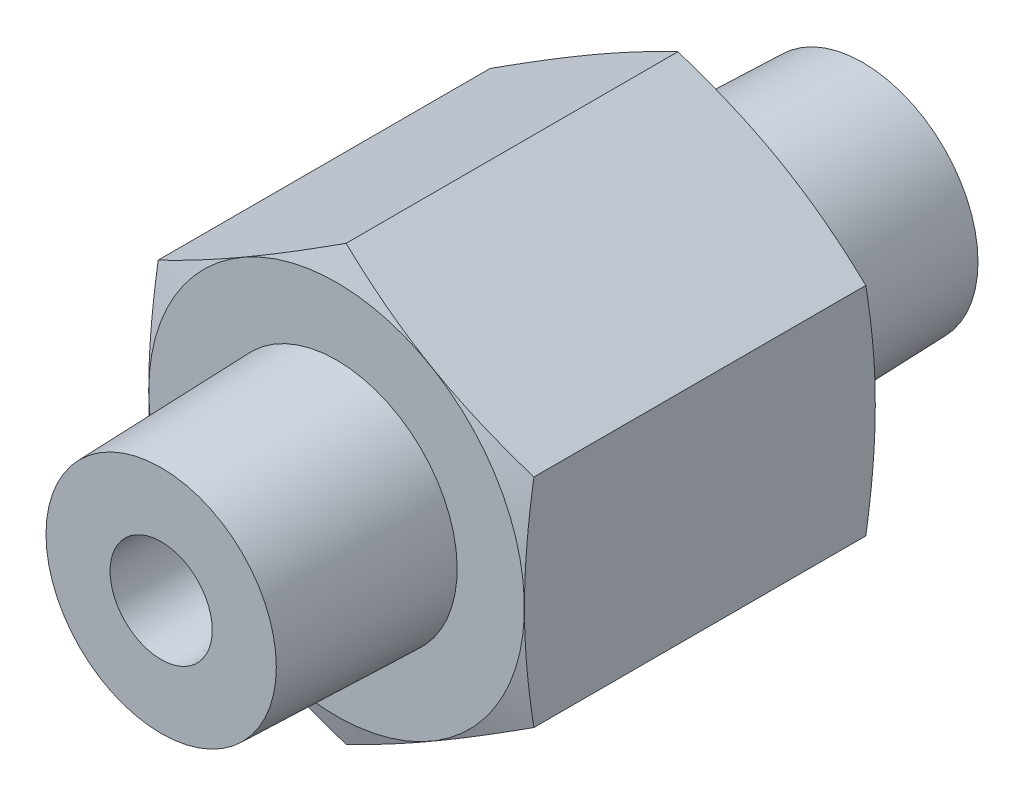
ISO-10303-21;
HEADER;
FILE_DESCRIPTION(('STEP AP214'),'2;1');
FILE_NAME('part.step','',(''),(''),'','','');
FILE_SCHEMA(('AUTOMOTIVE_DESIGN { 1 0 10303 214 1 1 1 1 }'));
ENDSEC;
DATA;
#1=APPLICATION_CONTEXT('core data for automotive mechanical design processes');
#2=APPLICATION_PROTOCOL_DEFINITION('international standard','automotive_design',2000,#1);
#3=PRODUCT_CONTEXT('',#1,'mechanical');
#4=PRODUCT('Part','Part','',(#3));
#5=PRODUCT_RELATED_PRODUCT_CATEGORY('part','',(#4));
#6=PRODUCT_DEFINITION_FORMATION('','',#4);
#7=PRODUCT_DEFINITION_CONTEXT('part definition',#1,'design');
#8=PRODUCT_DEFINITION('design','',#6,#7);
#9=PRODUCT_DEFINITION_SHAPE('','',#8);
#10=(LENGTH_UNIT() NAMED_UNIT(*) SI_UNIT(.MILLI.,.METRE.));
#11=(NAMED_UNIT(*) PLANE_ANGLE_UNIT() SI_UNIT($,.RADIAN.));
#12=(NAMED_UNIT(*) SI_UNIT($,.STERADIAN.) SOLID_ANGLE_UNIT());
#13=UNCERTAINTY_MEASURE_WITH_UNIT(LENGTH_MEASURE(1.E-05),#10,'distance_accuracy_value','');
#14=(GEOMETRIC_REPRESENTATION_CONTEXT(3) GLOBAL_UNCERTAINTY_ASSIGNED_CONTEXT((#13)) GLOBAL_UNIT_ASSIGNED_CONTEXT((#10,
#11,#12)) REPRESENTATION_CONTEXT('',''));
#15=CARTESIAN_POINT('',(0.,0.,0.));
#16=DIRECTION('',(0.,0.,1.));
#17=DIRECTION('',(1.,0.,0.));
#18=AXIS2_PLACEMENT_3D('',#15,#16,#17);
#19=CARTESIAN_POINT('',(-6.03249999999997,-33.4507708327137,0.));
#20=DIRECTION('',(0.5,-0.866025403784439,0.));
#21=DIRECTION('',(0.866025403784439,0.5,0.));
#22=AXIS2_PLACEMENT_3D('',#19,#20,#21);
#23=PLANE('',#22);
#24=CARTESIAN_POINT('',(-12.8328840177273,-37.3769743759413,12.3564425725315));
#25=CARTESIAN_POINT('',(-12.550927742631,-37.2141868446148,12.4095177281131));
#26=CARTESIAN_POINT('',(-12.268221299139,-37.050966203363,12.4577566042993));
#27=CARTESIAN_POINT('',(-11.7013331856382,-36.723673198433,12.5425743691434));
#28=CARTESIAN_POINT('',(-11.4171507160176,-36.5596003730986,12.5791460762072));
#29=CARTESIAN_POINT('',(-10.8498479774758,-36.2320679842894,12.6383459404696));
#30=CARTESIAN_POINT('',(-10.5667360662956,-36.0686132461587,12.6610780223526));
#31=CARTESIAN_POINT('',(-9.99997999919568,-35.7413964782538,12.6915643874731));
#32=CARTESIAN_POINT('',(-9.71633602461469,-35.5776345531754,12.6993230805206));
#33=CARTESIAN_POINT('',(-9.14904807545271,-35.2501107030187,12.6993230805206));
#34=CARTESIAN_POINT('',(-8.86540410087172,-35.0863487779404,12.6915643874731));
#35=CARTESIAN_POINT('',(-8.29864803377181,-34.7591320100354,12.6610780223526));
#36=CARTESIAN_POINT('',(-8.01553612259163,-34.5956772719047,12.6383459404696));
#37=CARTESIAN_POINT('',(-7.44823338404979,-34.2681448830956,12.5791460762072));
#38=CARTESIAN_POINT('',(-7.1640509144292,-34.1040720577611,12.5425743691434));
#39=CARTESIAN_POINT('',(-6.59716280092842,-33.7767790528311,12.4577566042993));
#40=CARTESIAN_POINT('',(-6.31445635743641,-33.6135584115793,12.4095177281131));
#41=CARTESIAN_POINT('',(-6.03250008234015,-33.4507708802528,12.3564425725315));
#42=B_SPLINE_CURVE_WITH_KNOTS('',3,(#24,#25,#26,#27,#28,#29,#30,#31,#32,#33,#34,#35,#36,#37,#38,
#39,#40,#41),.UNSPECIFIED.,.F.,.F.,(4,2,2,2,2,2,2,2,4),(0.,0.989698182463142,1.98000439227697,
2.96277938624906,3.94526489913871,4.92775041202836,5.91052540600045,6.90083161581427,
7.89052979827742),.UNSPECIFIED.);
#43=CARTESIAN_POINT('',(-12.8328840810797,-37.376974434443,12.3564425534643));
#44=VERTEX_POINT('',#43);
#45=CARTESIAN_POINT('',(-6.03250004117006,-33.4507708564832,12.3564425647844));
#46=VERTEX_POINT('',#45);
#47=EDGE_CURVE('E21',#44,#46,#42,.T.);
#48=ORIENTED_EDGE('',*,*,#47,.F.);
#49=DIRECTION('',(0.,0.,1.));
#50=VECTOR('',#49,1.);
#51=CARTESIAN_POINT('',(-12.8328841000674,-37.3769744234805,0.));
#52=LINE('',#51,#50);
#53=CARTESIAN_POINT('',(-12.8328840588973,-37.3769743997109,0.343557435215651));
#54=VERTEX_POINT('',#53);
#55=EDGE_CURVE('E73',#54,#44,#52,.T.);
#56=ORIENTED_EDGE('',*,*,#55,.F.);
#57=CARTESIAN_POINT('',(-6.03250008234016,-33.4507708802528,0.343557427468529));
#58=CARTESIAN_POINT('',(-6.31445635743643,-33.6135584115793,0.290482271886874));
#59=CARTESIAN_POINT('',(-6.59716280092843,-33.7767790528311,0.242243395700738));
#60=CARTESIAN_POINT('',(-7.1640509144292,-34.1040720577611,0.157425630856585));
#61=CARTESIAN_POINT('',(-7.44823338404979,-34.2681448830956,0.120853923792779));
#62=CARTESIAN_POINT('',(-8.01553612259164,-34.5956772719047,0.0616540595304248));
#63=CARTESIAN_POINT('',(-8.29864803377182,-34.7591320100354,0.0389219776474011));
#64=CARTESIAN_POINT('',(-8.86540410087173,-35.0863487779404,0.00843561252692523));
#65=CARTESIAN_POINT('',(-9.14904807545272,-35.2501107030187,0.000676919479423843));
#66=CARTESIAN_POINT('',(-9.7163360246147,-35.5776345531754,0.000676919479426301));
#67=CARTESIAN_POINT('',(-9.99997999919569,-35.7413964782538,0.00843561252693018));
#68=CARTESIAN_POINT('',(-10.5667360662956,-36.0686132461588,0.0389219776474103));
#69=CARTESIAN_POINT('',(-10.8498479774758,-36.2320679842894,0.0616540595304358));
#70=CARTESIAN_POINT('',(-11.4171507160176,-36.5596003730986,0.120853923792794));
#71=CARTESIAN_POINT('',(-11.7013331856382,-36.723673198433,0.157425630856602));
#72=CARTESIAN_POINT('',(-12.268221299139,-37.0509662033631,0.242243395700759));
#73=CARTESIAN_POINT('',(-12.550927742631,-37.2141868446148,0.290482271886897));
#74=CARTESIAN_POINT('',(-12.8328840177273,-37.3769743759413,0.343557427468553));
#75=B_SPLINE_CURVE_WITH_KNOTS('',3,(#57,#58,#59,#60,#61,#62,#63,#64,#65,#66,#67,#68,#69,#70,#71,
#72,#73,#74),.UNSPECIFIED.,.F.,.F.,(4,2,2,2,2,2,2,2,4),(0.,0.989698182463137,1.98000439227696,
2.96277938624906,3.94526489913871,4.92775041202836,5.91052540600045,6.90083161581428,
7.89052979827742),.UNSPECIFIED.);
#76=CARTESIAN_POINT('',(-6.03249999999997,-33.4507708546388,0.343557446535684));
#77=VERTEX_POINT('',#76);
#78=EDGE_CURVE('E90',#77,#54,#75,.T.);
#79=ORIENTED_EDGE('',*,*,#78,.F.);
#80=DIRECTION('',(0.,0.,-1.));
#81=VECTOR('',#80,1.);
#82=CARTESIAN_POINT('',(-6.03249999999997,-33.4507708327137,0.));
#83=LINE('',#82,#81);
#84=EDGE_CURVE('E88',#46,#77,#83,.T.);
#85=ORIENTED_EDGE('',*,*,#84,.F.);
#86=EDGE_LOOP('',(#48,#56,#79,#85));
#87=FACE_BOUND('',#86,.T.);
#88=ADVANCED_FACE('F17',(#87),#23,.T.);
#89=CARTESIAN_POINT('',(-12.8328841000674,-37.3769744234805,0.));
#90=DIRECTION('',(-0.5,-0.866025403784439,0.));
#91=DIRECTION('',(0.866025403784439,-0.5,0.));
#92=AXIS2_PLACEMENT_3D('',#89,#90,#91);
#93=PLANE('',#92);
#94=CARTESIAN_POINT('',(-19.6332682381102,-33.4507708107886,12.3564425498913));
#95=CARTESIAN_POINT('',(-19.3513119530993,-33.6135583478394,12.4095177087426));
#96=CARTESIAN_POINT('',(-19.0686054996384,-33.7767789948467,12.4577565880047));
#97=CARTESIAN_POINT('',(-18.5017173660647,-34.1040720113658,12.5425743583843));
#98=CARTESIAN_POINT('',(-18.2175348863401,-34.2681448425338,12.5791460679065));
#99=CARTESIAN_POINT('',(-17.6502321276936,-34.5956772429504,12.6383459361976));
#100=CARTESIAN_POINT('',(-17.3671202065141,-34.7591319868542,12.661078019664));
#101=CARTESIAN_POINT('',(-16.8003641193643,-35.086348766335,12.69156438692));
#102=CARTESIAN_POINT('',(-16.5167201347327,-35.2501106972161,12.6993230805206));
#103=CARTESIAN_POINT('',(-15.9494321654696,-35.5776345589782,12.6993230805206));
#104=CARTESIAN_POINT('',(-15.665788180838,-35.7413964898592,12.69156438692));
#105=CARTESIAN_POINT('',(-15.0990320936881,-36.06861326934,12.661078019664));
#106=CARTESIAN_POINT('',(-14.8159201725086,-36.2320680132438,12.6383459361976));
#107=CARTESIAN_POINT('',(-14.2486174138621,-36.5596004136604,12.5791460679064));
#108=CARTESIAN_POINT('',(-13.9644349341375,-36.7236732448284,12.5425743583843));
#109=CARTESIAN_POINT('',(-13.3975468005639,-37.0509662613475,12.4577565880046));
#110=CARTESIAN_POINT('',(-13.1148403471029,-37.2141869083548,12.4095177087426));
#111=CARTESIAN_POINT('',(-12.832884062092,-37.3769744454056,12.3564425498913));
#112=B_SPLINE_CURVE_WITH_KNOTS('',3,(#94,#95,#96,#97,#98,#99,#100,#101,#102,#103,#104,#105,#106,
#107,#108,#109,#110,#111),.UNSPECIFIED.,.F.,.F.,(4,2,2,2,2,2,2,2,4),(0.,0.989698217952918,
1.98000446335259,2.96277949217826,3.94526503987528,4.9277505875723,5.91052561639798,
6.90083186179764,7.89053007975056),.UNSPECIFIED.);
#113=CARTESIAN_POINT('',(-19.6332682001348,-33.4507707851745,12.3564425647844));
#114=VERTEX_POINT('',#113);
#115=EDGE_CURVE('E86',#114,#44,#112,.T.);
#116=ORIENTED_EDGE('',*,*,#115,.F.);
#117=DIRECTION('',(0.,0.,1.));
#118=VECTOR('',#117,1.);
#119=CARTESIAN_POINT('',(-19.6332682001348,-33.4507708327137,0.));
#120=LINE('',#119,#118);
#121=CARTESIAN_POINT('',(-19.6332681589647,-33.4507708564833,0.343557435215632));
#122=VERTEX_POINT('',#121);
#123=EDGE_CURVE('E188',#122,#114,#120,.T.);
#124=ORIENTED_EDGE('',*,*,#123,.F.);
#125=CARTESIAN_POINT('',(-12.832884062092,-37.3769744454056,0.343557450108682));
#126=CARTESIAN_POINT('',(-13.1148403420316,-37.2141869112828,0.290482292214261));
#127=CARTESIAN_POINT('',(-13.3975467903913,-37.0509662672206,0.242243413732464));
#128=CARTESIAN_POINT('',(-13.964434913709,-36.7236732566228,0.157425644457741));
#129=CARTESIAN_POINT('',(-14.2486173882789,-36.5596004284309,0.120853935259739));
#130=CARTESIAN_POINT('',(-14.8159201366915,-36.2320680339229,0.0616540670476583));
#131=CARTESIAN_POINT('',(-15.0990320527923,-36.0686132929513,0.038921983343592));
#132=CARTESIAN_POINT('',(-15.6657881297984,-35.7413965193269,0.00843561501878566));
#133=CARTESIAN_POINT('',(-15.9494321093649,-35.5776345913702,0.000676920587548373));
#134=CARTESIAN_POINT('',(-16.5167200685775,-35.2501107354108,0.000676918371346657));
#135=CARTESIAN_POINT('',(-16.8003640482235,-35.0863488074081,0.00843561058818436));
#136=CARTESIAN_POINT('',(-17.3671201254671,-34.7591320336467,0.0389219746398821));
#137=CARTESIAN_POINT('',(-17.650232041726,-34.5956772925838,0.0616540562851944));
#138=CARTESIAN_POINT('',(-18.2175347905018,-34.2681448978661,0.120853920626624));
#139=CARTESIAN_POINT('',(-18.5017172652771,-34.1040720695556,0.157425628014555));
#140=CARTESIAN_POINT('',(-19.0686053890338,-33.7767790587043,0.242243393963656));
#141=CARTESIAN_POINT('',(-19.351311837627,-33.6135584145073,0.290482270930066));
#142=CARTESIAN_POINT('',(-19.6332681177947,-33.4507708802528,0.343557427468551));
#143=B_SPLINE_CURVE_WITH_KNOTS('',3,(#125,#126,#127,#128,#129,#130,#131,#132,#133,#134,#135,
#136,#137,#138,#139,#140,#141,#142),.UNSPECIFIED.,.F.,.F.,(4,2,2,2,2,2,2,2,4),(0.,
0.989698200145738,1.98000442770477,2.96277943904958,3.94526496928586,4.92775049963624,
5.9105255110892,6.90083173874365,7.89052993901396),.UNSPECIFIED.);
#144=EDGE_CURVE('E139',#54,#122,#143,.T.);
#145=ORIENTED_EDGE('',*,*,#144,.F.);
#146=ORIENTED_EDGE('',*,*,#55,.T.);
#147=EDGE_LOOP('',(#116,#124,#145,#146));
#148=FACE_BOUND('',#147,.T.);
#149=ADVANCED_FACE('F161',(#148),#93,.T.);
#150=CARTESIAN_POINT('',(-19.6332682001348,-33.4507708327137,0.));
#151=DIRECTION('',(-1.,0.,0.));
#152=DIRECTION('',(0.,-1.,0.));
#153=AXIS2_PLACEMENT_3D('',#150,#151,#152);
#154=PLANE('',#153);
#155=CARTESIAN_POINT('',(-19.6332682001348,-25.59836360733,12.3564425498914));
#156=CARTESIAN_POINT('',(-19.6332682001348,-25.9239386755756,12.4095177077858));
#157=CARTESIAN_POINT('',(-19.6332682001348,-26.2503799636999,12.4577565862676));
#158=CARTESIAN_POINT('',(-19.6332682001348,-26.9049659848956,12.5425743555423));
#159=CARTESIAN_POINT('',(-19.6332682001348,-27.2331116412794,12.5791460647403));
#160=CARTESIAN_POINT('',(-19.6332682001348,-27.8881764302954,12.6383459329524));
#161=CARTESIAN_POINT('',(-19.6332682001348,-28.2150859122386,12.6610780166565));
#162=CARTESIAN_POINT('',(-19.6332682001348,-28.8695194594873,12.6915643849813));
#163=CARTESIAN_POINT('',(-19.6332682001348,-29.1970433154008,12.6993230794125));
#164=CARTESIAN_POINT('',(-19.6332682001348,-29.8520910273196,12.6993230816287));
#165=CARTESIAN_POINT('',(-19.6332682001348,-30.1796148833249,12.6915643894119));
#166=CARTESIAN_POINT('',(-19.6332682001348,-30.8340484308478,12.6610780253602));
#167=CARTESIAN_POINT('',(-19.6332682001348,-31.1609579129735,12.6383459437148));
#168=CARTESIAN_POINT('',(-19.6332682001348,-31.8160227024089,12.5791460793734));
#169=CARTESIAN_POINT('',(-19.6332682001348,-32.1441683590299,12.5425743719855));
#170=CARTESIAN_POINT('',(-19.6332682001348,-32.7987543807326,12.4577566060364));
#171=CARTESIAN_POINT('',(-19.6332682001348,-33.1251956691265,12.40951772907));
#172=CARTESIAN_POINT('',(-19.6332682001348,-33.4507707376354,12.3564425725315));
#173=B_SPLINE_CURVE_WITH_KNOTS('',3,(#155,#156,#157,#158,#159,#160,#161,#162,#163,#164,#165,
#166,#167,#168,#169,#170,#171,#172),.UNSPECIFIED.,.F.,.F.,(4,2,2,2,2,2,2,2,4),(0.,
0.989698200145731,1.98000442770475,2.96277943904954,3.94526496928581,4.92775049963618,
5.91052551108913,6.90083173874357,7.89052993901387),.UNSPECIFIED.);
#174=CARTESIAN_POINT('',(-19.6332681589647,-25.5983636274107,12.3564425647844));
#175=VERTEX_POINT('',#174);
#176=EDGE_CURVE('E167',#175,#114,#173,.T.);
#177=ORIENTED_EDGE('',*,*,#176,.F.);
#178=DIRECTION('',(0.,0.,1.));
#179=VECTOR('',#178,1.);
#180=CARTESIAN_POINT('',(-19.6332682001348,-25.5983636511802,0.));
#181=LINE('',#180,#179);
#182=CARTESIAN_POINT('',(-19.6332682001348,-25.5983636987193,0.343557435215582));
#183=VERTEX_POINT('',#182);
#184=EDGE_CURVE('E185',#183,#175,#181,.T.);
#185=ORIENTED_EDGE('',*,*,#184,.F.);
#186=CARTESIAN_POINT('',(-19.6332682001348,-33.4507708765639,0.343557450108652));
#187=CARTESIAN_POINT('',(-19.6332682001348,-33.1251958083183,0.29048229221423));
#188=CARTESIAN_POINT('',(-19.6332682001348,-32.798754520194,0.242243413732431));
#189=CARTESIAN_POINT('',(-19.6332682001348,-32.1441684989983,0.157425644457706));
#190=CARTESIAN_POINT('',(-19.6332682001348,-31.8160228426145,0.120853935259704));
#191=CARTESIAN_POINT('',(-19.6332682001348,-31.1609580535985,0.0616540670476204));
#192=CARTESIAN_POINT('',(-19.6332682001348,-30.8340485716553,0.0389219833435524));
#193=CARTESIAN_POINT('',(-19.6332682001348,-30.1796150244066,0.00843561501874323));
#194=CARTESIAN_POINT('',(-19.6332682001348,-29.8520911684931,0.000676920587504881));
#195=CARTESIAN_POINT('',(-19.6332682001348,-29.1970434565743,0.000676918371300269));
#196=CARTESIAN_POINT('',(-19.6332682001348,-28.869519600569,0.00843561058813616));
#197=CARTESIAN_POINT('',(-19.6332682001348,-28.2150860530461,0.0389219746398311));
#198=CARTESIAN_POINT('',(-19.6332682001348,-27.8881765709204,0.0616540562851423));
#199=CARTESIAN_POINT('',(-19.6332682001348,-27.233111781485,0.120853920626569));
#200=CARTESIAN_POINT('',(-19.6332682001348,-26.9049661248639,0.1574256280145));
#201=CARTESIAN_POINT('',(-19.6332682001348,-26.2503801031613,0.242243393963598));
#202=CARTESIAN_POINT('',(-19.6332682001348,-25.9239388147674,0.290482270930008));
#203=CARTESIAN_POINT('',(-19.6332682001348,-25.5983637462584,0.343557427468491));
#204=B_SPLINE_CURVE_WITH_KNOTS('',3,(#186,#187,#188,#189,#190,#191,#192,#193,#194,#195,#196,
#197,#198,#199,#200,#201,#202,#203),.UNSPECIFIED.,.F.,.F.,(4,2,2,2,2,2,2,2,4),(0.,
0.989698200145739,1.98000442770476,2.96277943904955,3.94526496928582,4.9277504996362,
5.91052551108915,6.90083173874359,7.89052993901389),.UNSPECIFIED.);
#205=EDGE_CURVE('E152',#122,#183,#204,.T.);
#206=ORIENTED_EDGE('',*,*,#205,.F.);
#207=ORIENTED_EDGE('',*,*,#123,.T.);
#208=EDGE_LOOP('',(#177,#185,#206,#207));
#209=FACE_BOUND('',#208,.T.);
#210=ADVANCED_FACE('F157',(#209),#154,.T.);
#211=CARTESIAN_POINT('',(-19.6332682001348,-25.5983636511802,0.));
#212=DIRECTION('',(-0.500000000000001,0.866025403784438,0.));
#213=DIRECTION('',(-0.866025403784438,-0.500000000000001,0.));
#214=AXIS2_PLACEMENT_3D('',#211,#212,#213);
#215=PLANE('',#214);
#216=CARTESIAN_POINT('',(-12.832884062092,-21.6721600384883,12.3564425498914));
#217=CARTESIAN_POINT('',(-13.1148403420315,-21.8349475726111,12.4095177077858));
#218=CARTESIAN_POINT('',(-13.3975467903913,-21.9981682166733,12.4577565862676));
#219=CARTESIAN_POINT('',(-13.964434913709,-22.3254612272711,12.5425743555424));
#220=CARTESIAN_POINT('',(-14.2486173882788,-22.489534055463,12.5791460647404));
#221=CARTESIAN_POINT('',(-14.8159201366914,-22.817066449971,12.6383459329524));
#222=CARTESIAN_POINT('',(-15.0990320527922,-22.9805211909426,12.6610780166565));
#223=CARTESIAN_POINT('',(-15.6657881297984,-23.307737964567,12.6915643849813));
#224=CARTESIAN_POINT('',(-15.9494321093649,-23.4714998925237,12.6993230794126));
#225=CARTESIAN_POINT('',(-16.5167200685775,-23.7990237484832,12.6993230816288));
#226=CARTESIAN_POINT('',(-16.8003640482235,-23.9627856764858,12.6915643894119));
#227=CARTESIAN_POINT('',(-17.3671201254671,-24.2900024502473,12.6610780253602));
#228=CARTESIAN_POINT('',(-17.650232041726,-24.4534571913101,12.6383459437149));
#229=CARTESIAN_POINT('',(-18.2175347905017,-24.7809895860278,12.5791460793735));
#230=CARTESIAN_POINT('',(-18.5017172652771,-24.9450624143383,12.5425743719855));
#231=CARTESIAN_POINT('',(-19.0686053890338,-25.2723554251897,12.4577566060364));
#232=CARTESIAN_POINT('',(-19.351311837627,-25.4355760693866,12.40951772907));
#233=CARTESIAN_POINT('',(-19.6332681177946,-25.5983636036411,12.3564425725315));
#234=B_SPLINE_CURVE_WITH_KNOTS('',3,(#216,#217,#218,#219,#220,#221,#222,#223,#224,#225,#226,
#227,#228,#229,#230,#231,#232,#233),.UNSPECIFIED.,.F.,.F.,(4,2,2,2,2,2,2,2,4),(0.,
0.98969820014575,1.98000442770479,2.9627794390496,3.94526496928588,4.92775049963627,
5.91052551108923,6.9008317387437,7.89052993901401),.UNSPECIFIED.);
#235=CARTESIAN_POINT('',(-12.8328840588973,-21.6721600841829,12.3564425647844));
#236=VERTEX_POINT('',#235);
#237=EDGE_CURVE('E97',#236,#175,#234,.T.);
#238=ORIENTED_EDGE('',*,*,#237,.F.);
#239=DIRECTION('',(0.,0.,1.));
#240=VECTOR('',#239,1.);
#241=CARTESIAN_POINT('',(-12.8328841000674,-21.6721600604134,0.));
#242=LINE('',#241,#240);
#243=CARTESIAN_POINT('',(-12.8328841412375,-21.6721600841829,0.343557435215571));
#244=VERTEX_POINT('',#243);
#245=EDGE_CURVE('E190',#244,#236,#242,.T.);
#246=ORIENTED_EDGE('',*,*,#245,.F.);
#247=CARTESIAN_POINT('',(-19.6332682381102,-25.5983636731053,0.343557450108609));
#248=CARTESIAN_POINT('',(-19.3513119581706,-25.4355761389825,0.290482292214186));
#249=CARTESIAN_POINT('',(-19.0686055098109,-25.2723554949204,0.242243413732385));
#250=CARTESIAN_POINT('',(-18.5017173864932,-24.9450624843225,0.157425644457658));
#251=CARTESIAN_POINT('',(-18.2175349119234,-24.7809896561306,0.120853935259654));
#252=CARTESIAN_POINT('',(-17.6502321635107,-24.4534572616226,0.0616540670475697));
#253=CARTESIAN_POINT('',(-17.3671202474099,-24.290002520651,0.0389219833435019));
#254=CARTESIAN_POINT('',(-16.8003641704038,-23.9627857470266,0.00843561501869313));
#255=CARTESIAN_POINT('',(-16.5167201908373,-23.7990238190699,0.000676920587455213));
#256=CARTESIAN_POINT('',(-15.9494322316247,-23.4714999631105,0.0006769183712529));
#257=CARTESIAN_POINT('',(-15.6657882519787,-23.3077380351078,0.00843561058809058));
#258=CARTESIAN_POINT('',(-15.0990321747351,-22.9805212613464,0.0389219746397892));
#259=CARTESIAN_POINT('',(-14.8159202584762,-22.8170665202835,0.0616540562851022));
#260=CARTESIAN_POINT('',(-14.2486175097004,-22.4895341255658,0.120853920626534));
#261=CARTESIAN_POINT('',(-13.9644350349251,-22.3254612972553,0.157425628014467));
#262=CARTESIAN_POINT('',(-13.3975469111684,-21.998168286404,0.242243393963571));
#263=CARTESIAN_POINT('',(-13.1148404625751,-21.834947642207,0.290482270929984));
#264=CARTESIAN_POINT('',(-12.8328841824075,-21.6721601079525,0.34355742746847));
#265=B_SPLINE_CURVE_WITH_KNOTS('',3,(#247,#248,#249,#250,#251,#252,#253,#254,#255,#256,#257,
#258,#259,#260,#261,#262,#263,#264),.UNSPECIFIED.,.F.,.F.,(4,2,2,2,2,2,2,2,4),(0.,
0.989698200145752,1.98000442770478,2.96277943904959,3.94526496928588,4.92775049963627,
5.91052551108924,6.9008317387437,7.89052993901401),.UNSPECIFIED.);
#266=EDGE_CURVE('E148',#183,#244,#265,.T.);
#267=ORIENTED_EDGE('',*,*,#266,.F.);
#268=ORIENTED_EDGE('',*,*,#184,.T.);
#269=EDGE_LOOP('',(#238,#246,#267,#268));
#270=FACE_BOUND('',#269,.T.);
#271=ADVANCED_FACE('F160',(#270),#215,.T.);
#272=CARTESIAN_POINT('',(-12.8328841000674,-21.6721600604134,0.));
#273=DIRECTION('',(0.499999999999999,0.866025403784439,0.));
#274=DIRECTION('',(-0.866025403784439,0.499999999999999,0.));
#275=AXIS2_PLACEMENT_3D('',#272,#273,#274);
#276=PLANE('',#275);
#277=CARTESIAN_POINT('',(-6.03249996202456,-25.5983636731052,12.3564425498914));
#278=CARTESIAN_POINT('',(-6.31445624196411,-25.4355761389824,12.4095177077858));
#279=CARTESIAN_POINT('',(-6.59716269032386,-25.2723554949203,12.4577565862676));
#280=CARTESIAN_POINT('',(-7.16405081364155,-24.9450624843224,12.5425743555423));
#281=CARTESIAN_POINT('',(-7.4482332882114,-24.7809896561306,12.5791460647403));
#282=CARTESIAN_POINT('',(-8.015536036624,-24.4534572616225,12.6383459329524));
#283=CARTESIAN_POINT('',(-8.29864795272482,-24.2900025206509,12.6610780166565));
#284=CARTESIAN_POINT('',(-8.86540402973094,-23.9627857470266,12.6915643849813));
#285=CARTESIAN_POINT('',(-9.14904800929749,-23.7990238190698,12.6993230794125));
#286=CARTESIAN_POINT('',(-9.71633596851005,-23.4714999631104,12.6993230816287));
#287=CARTESIAN_POINT('',(-9.99997994815607,-23.3077380351078,12.6915643894119));
#288=CARTESIAN_POINT('',(-10.5667360253997,-22.9805212613463,12.6610780253602));
#289=CARTESIAN_POINT('',(-10.8498479416586,-22.8170665202835,12.6383459437149));
#290=CARTESIAN_POINT('',(-11.4171506904343,-22.4895341255658,12.5791460793735));
#291=CARTESIAN_POINT('',(-11.7013331652097,-22.3254612972552,12.5425743719855));
#292=CARTESIAN_POINT('',(-12.2682212889664,-21.9981682864039,12.4577566060364));
#293=CARTESIAN_POINT('',(-12.5509277375596,-21.834947642207,12.40951772907));
#294=CARTESIAN_POINT('',(-12.8328840177272,-21.6721601079525,12.3564425725315));
#295=B_SPLINE_CURVE_WITH_KNOTS('',3,(#277,#278,#279,#280,#281,#282,#283,#284,#285,#286,#287,
#288,#289,#290,#291,#292,#293,#294),.UNSPECIFIED.,.F.,.F.,(4,2,2,2,2,2,2,2,4),(0.,
0.98969820014575,1.98000442770479,2.96277943904959,3.94526496928588,4.92775049963627,
5.91052551108923,6.9008317387437,7.89052993901401),.UNSPECIFIED.);
#296=CARTESIAN_POINT('',(-6.03249999999997,-25.5983636987193,12.3564425647844));
#297=VERTEX_POINT('',#296);
#298=EDGE_CURVE('E96',#297,#236,#295,.T.);
#299=ORIENTED_EDGE('',*,*,#298,.F.);
#300=DIRECTION('',(0.,0.,-1.));
#301=VECTOR('',#300,1.);
#302=CARTESIAN_POINT('',(-6.03249999999997,-25.5983636511802,0.));
#303=LINE('',#302,#301);
#304=CARTESIAN_POINT('',(-6.03250004117005,-25.5983636274106,0.34355743521559));
#305=VERTEX_POINT('',#304);
#306=EDGE_CURVE('E93',#305,#297,#303,.F.);
#307=ORIENTED_EDGE('',*,*,#306,.F.);
#308=CARTESIAN_POINT('',(-12.8328841380428,-21.6721600384883,0.343557450108605));
#309=CARTESIAN_POINT('',(-12.5509278581032,-21.8349475726111,0.290482292214184));
#310=CARTESIAN_POINT('',(-12.2682214097435,-21.9981682166732,0.242243413732385));
#311=CARTESIAN_POINT('',(-11.7013332864258,-22.3254612272711,0.157425644457661));
#312=CARTESIAN_POINT('',(-11.4171508118559,-22.489534055463,0.12085393525966));
#313=CARTESIAN_POINT('',(-10.8498480634433,-22.817066449971,0.061654067047579));
#314=CARTESIAN_POINT('',(-10.5667361473425,-22.9805211909426,0.0389219833435132));
#315=CARTESIAN_POINT('',(-9.99998007033641,-23.3077379645669,0.00843561501870862));
#316=CARTESIAN_POINT('',(-9.71633609076986,-23.4714998925237,0.000676920587472768));
#317=CARTESIAN_POINT('',(-9.1490481315573,-23.7990237484831,0.000676918371274485));
#318=CARTESIAN_POINT('',(-8.86540415191129,-23.9627856764857,0.00843561058811413));
#319=CARTESIAN_POINT('',(-8.29864807466766,-24.2900024502472,0.038921974639816));
#320=CARTESIAN_POINT('',(-8.0155361584088,-24.45345719131,0.0616540562851304));
#321=CARTESIAN_POINT('',(-7.44823340963304,-24.7809895860277,0.120853920626565));
#322=CARTESIAN_POINT('',(-7.16405093485768,-24.9450624143383,0.157425628014499));
#323=CARTESIAN_POINT('',(-6.59716281110097,-25.2723554251896,0.242243393963605));
#324=CARTESIAN_POINT('',(-6.31445636250775,-25.4355760693865,0.290482270930019));
#325=CARTESIAN_POINT('',(-6.03250008234013,-25.598363603641,0.343557427468505));
#326=B_SPLINE_CURVE_WITH_KNOTS('',3,(#308,#309,#310,#311,#312,#313,#314,#315,#316,#317,#318,
#319,#320,#321,#322,#323,#324,#325),.UNSPECIFIED.,.F.,.F.,(4,2,2,2,2,2,2,2,4),(0.,
0.989698200145747,1.98000442770478,2.96277943904959,3.94526496928587,4.92775049963626,
5.91052551108922,6.90083173874368,7.89052993901399),.UNSPECIFIED.);
#327=EDGE_CURVE('E40',#244,#305,#326,.T.);
#328=ORIENTED_EDGE('',*,*,#327,.F.);
#329=ORIENTED_EDGE('',*,*,#245,.T.);
#330=EDGE_LOOP('',(#299,#307,#328,#329));
#331=FACE_BOUND('',#330,.T.);
#332=ADVANCED_FACE('F112',(#331),#276,.T.);
#333=CARTESIAN_POINT('',(-6.03249999999997,-25.5983636511802,0.));
#334=DIRECTION('',(1.,0.,0.));
#335=DIRECTION('',(0.,0.,-1.));
#336=AXIS2_PLACEMENT_3D('',#333,#334,#335);
#337=PLANE('',#336);
#338=CARTESIAN_POINT('',(-6.03249999999997,-33.4507708765639,12.3564425498914));
#339=CARTESIAN_POINT('',(-6.03249999999997,-33.1251958083183,12.4095177077858));
#340=CARTESIAN_POINT('',(-6.03249999999997,-32.798754520194,12.4577565862676));
#341=CARTESIAN_POINT('',(-6.03249999999997,-32.1441684989983,12.5425743555423));
#342=CARTESIAN_POINT('',(-6.03249999999997,-31.8160228426145,12.5791460647403));
#343=CARTESIAN_POINT('',(-6.03249999999997,-31.1609580535984,12.6383459329524));
#344=CARTESIAN_POINT('',(-6.03249999999997,-30.8340485716553,12.6610780166565));
#345=CARTESIAN_POINT('',(-6.03249999999997,-30.1796150244066,12.6915643849813));
#346=CARTESIAN_POINT('',(-6.03249999999997,-29.8520911684931,12.6993230794125));
#347=CARTESIAN_POINT('',(-6.03249999999997,-29.1970434565743,12.6993230816287));
#348=CARTESIAN_POINT('',(-6.03249999999997,-28.869519600569,12.6915643894119));
#349=CARTESIAN_POINT('',(-6.03249999999997,-28.2150860530461,12.6610780253602));
#350=CARTESIAN_POINT('',(-6.03249999999997,-27.8881765709204,12.6383459437149));
#351=CARTESIAN_POINT('',(-6.03249999999997,-27.233111781485,12.5791460793734));
#352=CARTESIAN_POINT('',(-6.03249999999997,-26.9049661248639,12.5425743719855));
#353=CARTESIAN_POINT('',(-6.03249999999997,-26.2503801031613,12.4577566060364));
#354=CARTESIAN_POINT('',(-6.03249999999997,-25.9239388147674,12.40951772907));
#355=CARTESIAN_POINT('',(-6.03249999999997,-25.5983637462584,12.3564425725315));
#356=B_SPLINE_CURVE_WITH_KNOTS('',3,(#338,#339,#340,#341,#342,#343,#344,#345,#346,#347,#348,
#349,#350,#351,#352,#353,#354,#355),.UNSPECIFIED.,.F.,.F.,(4,2,2,2,2,2,2,2,4),(0.,
0.989698200145733,1.98000442770476,2.96277943904955,3.94526496928583,4.9277504996362,
5.91052551108916,6.9008317387436,7.8905299390139),.UNSPECIFIED.);
#357=EDGE_CURVE('E84',#46,#297,#356,.T.);
#358=ORIENTED_EDGE('',*,*,#357,.F.);
#359=ORIENTED_EDGE('',*,*,#84,.T.);
#360=CARTESIAN_POINT('',(-6.03249999999997,-25.59836360733,0.343557450108613));
#361=CARTESIAN_POINT('',(-6.03249999999997,-25.9239386814315,0.290482291257363));
#362=CARTESIAN_POINT('',(-6.03249999999997,-26.2503799754462,0.242243411995292));
#363=CARTESIAN_POINT('',(-6.03249999999997,-26.9049660084844,0.157425641615625));
#364=CARTESIAN_POINT('',(-6.03249999999997,-27.2331116708204,0.1208539320935));
#365=CARTESIAN_POINT('',(-6.03249999999997,-27.8881764716535,0.0616540638023479));
#366=CARTESIAN_POINT('',(-6.03249999999997,-28.2150859594611,0.0389219803359948));
#367=CARTESIAN_POINT('',(-6.03249999999997,-28.8695195184227,0.00843561307997147));
#368=CARTESIAN_POINT('',(-6.03249999999997,-29.1970433801848,0.000676919479401103));
#369=CARTESIAN_POINT('',(-6.03249999999997,-29.852091103709,0.000676919479404914));
#370=CARTESIAN_POINT('',(-6.03249999999997,-30.1796149654711,0.00843561307997898));
#371=CARTESIAN_POINT('',(-6.03249999999997,-30.8340485244328,0.0389219803360099));
#372=CARTESIAN_POINT('',(-6.03249999999997,-31.1609580122403,0.061654063802367));
#373=CARTESIAN_POINT('',(-6.03249999999997,-31.8160228130735,0.120853932093526));
#374=CARTESIAN_POINT('',(-6.03249999999997,-32.1441684754095,0.157425641615654));
#375=CARTESIAN_POINT('',(-6.03249999999997,-32.7987545084477,0.242243411995327));
#376=CARTESIAN_POINT('',(-6.03249999999997,-33.1251958024624,0.290482291257401));
#377=CARTESIAN_POINT('',(-6.03249999999997,-33.4507708765639,0.343557450108653));
#378=B_SPLINE_CURVE_WITH_KNOTS('',3,(#360,#361,#362,#363,#364,#365,#366,#367,#368,#369,#370,
#371,#372,#373,#374,#375,#376,#377),.UNSPECIFIED.,.F.,.F.,(4,2,2,2,2,2,2,2,4),(0.,
0.989698217952909,1.98000446335256,2.96277949217823,3.94526503987524,4.92775058757225,
5.91052561639792,6.90083186179758,7.89053007975049),.UNSPECIFIED.);
#379=EDGE_CURVE('E117',#305,#77,#378,.T.);
#380=ORIENTED_EDGE('',*,*,#379,.F.);
#381=ORIENTED_EDGE('',*,*,#306,.T.);
#382=EDGE_LOOP('',(#358,#359,#380,#381));
#383=FACE_BOUND('',#382,.T.);
#384=ADVANCED_FACE('F95',(#383),#337,.T.);
#385=CARTESIAN_POINT('',(-12.8328841000674,-29.5245672419468,12.3543812123793));
#386=DIRECTION('',(0.,0.,-1.));
#387=DIRECTION('',(-1.,0.,0.));
#388=AXIS2_PLACEMENT_3D('',#385,#386,#387);
#389=CONICAL_SURFACE('',#388,7.8587317815344,1.2557281098261);
#390=CARTESIAN_POINT('',(-12.8328841000674,-29.5245672419468,12.6999999999979));
#391=DIRECTION('',(0.,0.,-1.));
#392=DIRECTION('',(-1.,0.,0.));
#393=AXIS2_PLACEMENT_3D('',#390,#391,#392);
#394=CIRCLE('',#393,6.79830718153276);
#395=CARTESIAN_POINT('',(-19.6311912816002,-29.5245672419468,12.6999999999979));
#396=VERTEX_POINT('',#395);
#397=EDGE_CURVE('E123',#396,#396,#394,.F.);
#398=ORIENTED_EDGE('',*,*,#397,.F.);
#399=EDGE_LOOP('',(#398));
#400=FACE_BOUND('',#399,.T.);
#401=ORIENTED_EDGE('',*,*,#176,.T.);
#402=ORIENTED_EDGE('',*,*,#115,.T.);
#403=ORIENTED_EDGE('',*,*,#47,.T.);
#404=ORIENTED_EDGE('',*,*,#357,.T.);
#405=ORIENTED_EDGE('',*,*,#298,.T.);
#406=ORIENTED_EDGE('',*,*,#237,.T.);
#407=EDGE_LOOP('',(#401,#402,#403,#404,#405,#406));
#408=FACE_BOUND('',#407,.T.);
#409=ADVANCED_FACE('F81',(#400,#408),#389,.T.);
#410=CARTESIAN_POINT('',(-12.8328841000674,-29.5245672419468,0.345618787620742));
#411=DIRECTION('',(0.,0.,1.));
#412=DIRECTION('',(1.,0.,0.));
#413=AXIS2_PLACEMENT_3D('',#410,#411,#412);
#414=CONICAL_SURFACE('',#413,7.8587317815344,1.2557281098261);
#415=CARTESIAN_POINT('',(-12.8328841000674,-29.5245672419468,2.12189207177138E-12));
#416=DIRECTION('',(0.,0.,1.));
#417=DIRECTION('',(1.,0.,0.));
#418=AXIS2_PLACEMENT_3D('',#415,#416,#417);
#419=CIRCLE('',#418,6.79830718153276);
#420=CARTESIAN_POINT('',(-6.03457691853463,-29.5245672419468,2.12189207177138E-12));
#421=VERTEX_POINT('',#420);
#422=EDGE_CURVE('E211',#421,#421,#419,.T.);
#423=ORIENTED_EDGE('',*,*,#422,.T.);
#424=EDGE_LOOP('',(#423));
#425=FACE_BOUND('',#424,.T.);
#426=ORIENTED_EDGE('',*,*,#327,.T.);
#427=ORIENTED_EDGE('',*,*,#379,.T.);
#428=ORIENTED_EDGE('',*,*,#78,.T.);
#429=ORIENTED_EDGE('',*,*,#144,.T.);
#430=ORIENTED_EDGE('',*,*,#205,.T.);
#431=ORIENTED_EDGE('',*,*,#266,.T.);
#432=EDGE_LOOP('',(#426,#427,#428,#429,#430,#431));
#433=FACE_BOUND('',#432,.T.);
#434=ADVANCED_FACE('F129',(#425,#433),#414,.T.);
#435=CARTESIAN_POINT('',(-12.8328841000674,-29.5245672419468,12.7));
#436=DIRECTION('',(0.,0.,1.));
#437=DIRECTION('',(1.,0.,0.));
#438=AXIS2_PLACEMENT_3D('',#435,#436,#437);
#439=PLANE('',#438);
#440=CARTESIAN_POINT('',(-12.8328841000674,-29.5245672419468,12.6999999999953));
#441=DIRECTION('',(0.,0.,-1.));
#442=DIRECTION('',(0.,1.,0.));
#443=AXIS2_PLACEMENT_3D('',#440,#441,#442);
#444=CIRCLE('',#443,4.36562388906116);
#445=CARTESIAN_POINT('',(-12.8328841000674,-25.1589433528856,12.6999999999953));
#446=VERTEX_POINT('',#445);
#447=EDGE_CURVE('E209',#446,#446,#444,.F.);
#448=ORIENTED_EDGE('',*,*,#447,.F.);
#449=EDGE_LOOP('',(#448));
#450=FACE_BOUND('',#449,.T.);
#451=ORIENTED_EDGE('',*,*,#397,.T.);
#452=EDGE_LOOP('',(#451));
#453=FACE_BOUND('',#452,.T.);
#454=ADVANCED_FACE('F133',(#450,#453),#439,.T.);
#455=CARTESIAN_POINT('',(-12.8328841000674,-29.5245672419468,0.));
#456=DIRECTION('',(0.,0.,1.));
#457=DIRECTION('',(1.,0.,0.));
#458=AXIS2_PLACEMENT_3D('',#455,#456,#457);
#459=PLANE('',#458);
#460=CARTESIAN_POINT('',(-12.8328841000674,-29.5245672419468,0.));
#461=DIRECTION('',(0.,0.,1.));
#462=DIRECTION('',(1.,0.,0.));
#463=AXIS2_PLACEMENT_3D('',#460,#461,#462);
#464=CIRCLE('',#463,4.36562388906292);
#465=CARTESIAN_POINT('',(-8.46726021100449,-29.5245672419468,0.));
#466=VERTEX_POINT('',#465);
#467=EDGE_CURVE('E206',#466,#466,#464,.F.);
#468=ORIENTED_EDGE('',*,*,#467,.F.);
#469=EDGE_LOOP('',(#468));
#470=FACE_BOUND('',#469,.T.);
#471=ORIENTED_EDGE('',*,*,#422,.F.);
#472=EDGE_LOOP('',(#471));
#473=FACE_BOUND('',#472,.T.);
#474=ADVANCED_FACE('F249',(#470,#473),#459,.F.);
#475=CARTESIAN_POINT('',(-12.8328841000674,-29.5245672419468,12.700000000109));
#476=DIRECTION('',(0.,0.,-1.));
#477=DIRECTION('',(0.,1.,0.));
#478=AXIS2_PLACEMENT_3D('',#475,#476,#477);
#479=CONICAL_SURFACE('',#478,4.36562388905762,0.0311244565510314);
#480=ORIENTED_EDGE('',*,*,#447,.T.);
#481=EDGE_LOOP('',(#480));
#482=FACE_BOUND('',#481,.T.);
#483=CARTESIAN_POINT('',(-12.8328841000674,-29.5245672419468,19.0499999999929));
#484=DIRECTION('',(0.,0.,-1.));
#485=DIRECTION('',(0.,1.,0.));
#486=AXIS2_PLACEMENT_3D('',#483,#484,#485);
#487=CIRCLE('',#486,4.16791974507536);
#488=CARTESIAN_POINT('',(-12.8328841000674,-25.3566474968714,19.0499999999929));
#489=VERTEX_POINT('',#488);
#490=EDGE_CURVE('E203',#489,#489,#487,.T.);
#491=ORIENTED_EDGE('',*,*,#490,.T.);
#492=EDGE_LOOP('',(#491));
#493=FACE_BOUND('',#492,.T.);
#494=ADVANCED_FACE('F246',(#482,#493),#479,.T.);
#495=CARTESIAN_POINT('',(-12.8328841000674,-29.5245672419468,-2.27373675443232E-10));
#496=DIRECTION('',(0.,0.,1.));
#497=DIRECTION('',(1.,0.,0.));
#498=AXIS2_PLACEMENT_3D('',#495,#496,#497);
#499=CONICAL_SURFACE('',#498,4.36562388905584,0.0311244565513078);
#500=ORIENTED_EDGE('',*,*,#467,.T.);
#501=EDGE_LOOP('',(#500));
#502=FACE_BOUND('',#501,.T.);
#503=CARTESIAN_POINT('',(-12.8328841000674,-29.5245672419468,-6.34999999999764));
#504=DIRECTION('',(0.,0.,1.));
#505=DIRECTION('',(1.,0.,0.));
#506=AXIS2_PLACEMENT_3D('',#503,#504,#505);
#507=CIRCLE('',#506,4.16791974507537);
#508=CARTESIAN_POINT('',(-8.66496435499204,-29.5245672419468,-6.34999999999764));
#509=VERTEX_POINT('',#508);
#510=EDGE_CURVE('E200',#509,#509,#507,.F.);
#511=ORIENTED_EDGE('',*,*,#510,.F.);
#512=EDGE_LOOP('',(#511));
#513=FACE_BOUND('',#512,.T.);
#514=ADVANCED_FACE('F242',(#502,#513),#499,.T.);
#515=CARTESIAN_POINT('',(-12.8328841000674,-29.5245672419468,19.05));
#516=DIRECTION('',(0.,0.,-1.));
#517=DIRECTION('',(-1.,0.,0.));
#518=AXIS2_PLACEMENT_3D('',#515,#516,#517);
#519=PLANE('',#518);
#520=CARTESIAN_POINT('',(-12.8328841000674,-29.5245672419468,19.0499999999929));
#521=DIRECTION('',(0.,0.,1.));
#522=DIRECTION('',(1.,0.,0.));
#523=AXIS2_PLACEMENT_3D('',#520,#521,#522);
#524=CIRCLE('',#523,1.84870414398824);
#525=CARTESIAN_POINT('',(-10.9841799560791,-29.5245672419468,19.0499999999929));
#526=VERTEX_POINT('',#525);
#527=EDGE_CURVE('E197',#526,#526,#524,.F.);
#528=ORIENTED_EDGE('',*,*,#527,.T.);
#529=EDGE_LOOP('',(#528));
#530=FACE_BOUND('',#529,.T.);
#531=ORIENTED_EDGE('',*,*,#490,.F.);
#532=EDGE_LOOP('',(#531));
#533=FACE_BOUND('',#532,.T.);
#534=ADVANCED_FACE('F238',(#530,#533),#519,.F.);
#535=CARTESIAN_POINT('',(-12.8328841000674,-29.5245672419468,-6.35));
#536=DIRECTION('',(0.,0.,-1.));
#537=DIRECTION('',(-1.,0.,0.));
#538=AXIS2_PLACEMENT_3D('',#535,#536,#537);
#539=PLANE('',#538);
#540=CARTESIAN_POINT('',(-12.8328841000674,-29.5245672419468,-6.35));
#541=DIRECTION('',(0.,0.,1.));
#542=DIRECTION('',(1.,0.,0.));
#543=AXIS2_PLACEMENT_3D('',#540,#541,#542);
#544=CIRCLE('',#543,1.651);
#545=CARTESIAN_POINT('',(-11.1818841000674,-29.5245672419468,-6.35));
#546=VERTEX_POINT('',#545);
#547=EDGE_CURVE('E31',#546,#546,#544,.T.);
#548=ORIENTED_EDGE('',*,*,#547,.T.);
#549=EDGE_LOOP('',(#548));
#550=FACE_BOUND('',#549,.T.);
#551=ORIENTED_EDGE('',*,*,#510,.T.);
#552=EDGE_LOOP('',(#551));
#553=FACE_BOUND('',#552,.T.);
#554=ADVANCED_FACE('F230',(#550,#553),#539,.T.);
#555=CARTESIAN_POINT('',(-12.8328841000674,-29.5245672419468,19.0499999999929));
#556=DIRECTION('',(0.,0.,1.));
#557=DIRECTION('',(1.,0.,0.));
#558=AXIS2_PLACEMENT_3D('',#555,#556,#557);
#559=CONICAL_SURFACE('',#558,1.84870414398824,0.0311244565510314);
#560=CARTESIAN_POINT('',(-12.8328841000674,-29.5245672419468,12.7));
#561=DIRECTION('',(0.,0.,1.));
#562=DIRECTION('',(1.,0.,0.));
#563=AXIS2_PLACEMENT_3D('',#560,#561,#562);
#564=CIRCLE('',#563,1.651);
#565=CARTESIAN_POINT('',(-11.1818841000674,-29.5245672419468,12.7));
#566=VERTEX_POINT('',#565);
#567=EDGE_CURVE('E11',#566,#566,#564,.F.);
#568=ORIENTED_EDGE('',*,*,#567,.T.);
#569=EDGE_LOOP('',(#568));
#570=FACE_BOUND('',#569,.T.);
#571=ORIENTED_EDGE('',*,*,#527,.F.);
#572=EDGE_LOOP('',(#571));
#573=FACE_BOUND('',#572,.T.);
#574=ADVANCED_FACE('F224',(#570,#573),#559,.F.);
#575=CARTESIAN_POINT('',(-12.8328841000674,-29.5245672419468,-15.4873125681076));
#576=DIRECTION('',(0.,0.,1.));
#577=DIRECTION('',(1.,0.,0.));
#578=AXIS2_PLACEMENT_3D('',#575,#576,#577);
#579=CYLINDRICAL_SURFACE('',#578,1.651);
#580=ORIENTED_EDGE('',*,*,#567,.F.);
#581=EDGE_LOOP('',(#580));
#582=FACE_BOUND('',#581,.T.);
#583=ORIENTED_EDGE('',*,*,#547,.F.);
#584=EDGE_LOOP('',(#583));
#585=FACE_BOUND('',#584,.T.);
#586=ADVANCED_FACE('F222',(#582,#585),#579,.F.);
#587=CLOSED_SHELL('',(#88,#149,#210,#271,#332,#384,#409,#434,#454,#474,#494,#514,#534,#554,#574,#586));
#588=MANIFOLD_SOLID_BREP('B1',#587);
#589=ADVANCED_BREP_SHAPE_REPRESENTATION('',(#18,#588),#14);
#590=SHAPE_DEFINITION_REPRESENTATION(#9,#589);
ENDSEC;
END-ISO-10303-21;
